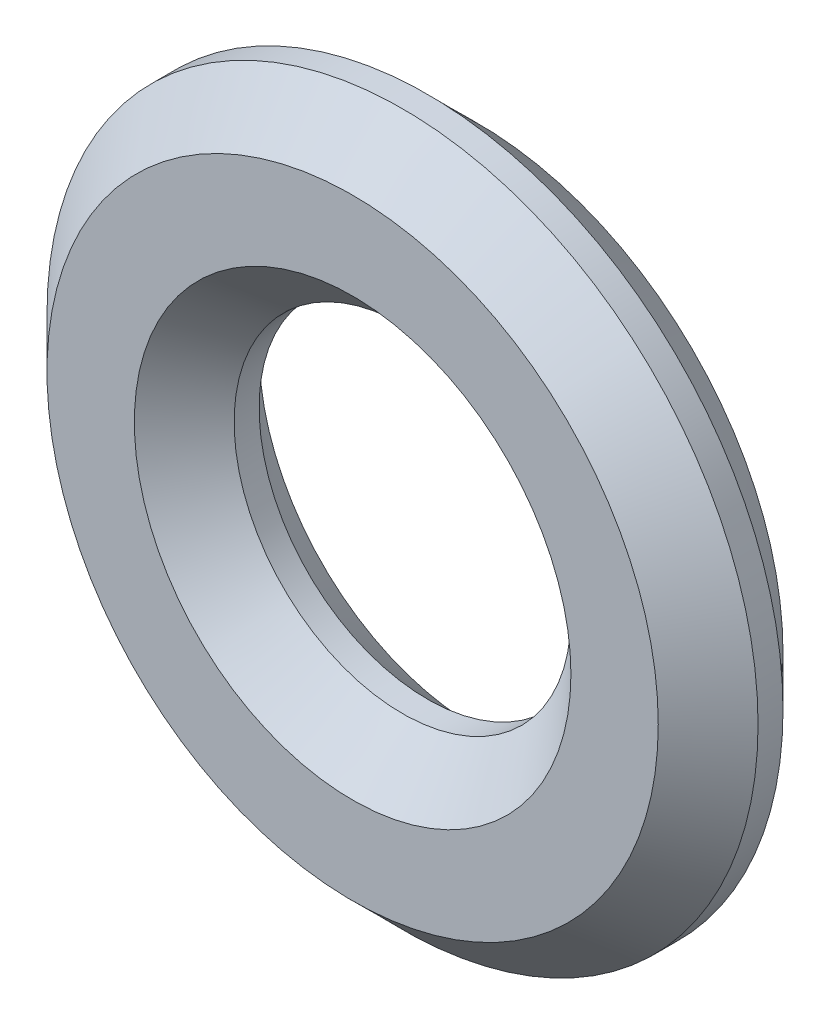
ISO-10303-21;
HEADER;
FILE_DESCRIPTION(('STEP AP214'),'2;1');
FILE_NAME('part.step','',(''),(''),'','','');
FILE_SCHEMA(('AUTOMOTIVE_DESIGN { 1 0 10303 214 1 1 1 1 }'));
ENDSEC;
DATA;
#1=APPLICATION_CONTEXT('core data for automotive mechanical design processes');
#2=APPLICATION_PROTOCOL_DEFINITION('international standard','automotive_design',2000,#1);
#3=PRODUCT_CONTEXT('',#1,'mechanical');
#4=PRODUCT('Part','Part','',(#3));
#5=PRODUCT_RELATED_PRODUCT_CATEGORY('part','',(#4));
#6=PRODUCT_DEFINITION_FORMATION('','',#4);
#7=PRODUCT_DEFINITION_CONTEXT('part definition',#1,'design');
#8=PRODUCT_DEFINITION('design','',#6,#7);
#9=PRODUCT_DEFINITION_SHAPE('','',#8);
#10=(LENGTH_UNIT() NAMED_UNIT(*) SI_UNIT(.MILLI.,.METRE.));
#11=(NAMED_UNIT(*) PLANE_ANGLE_UNIT() SI_UNIT($,.RADIAN.));
#12=(NAMED_UNIT(*) SI_UNIT($,.STERADIAN.) SOLID_ANGLE_UNIT());
#13=UNCERTAINTY_MEASURE_WITH_UNIT(LENGTH_MEASURE(1.E-05),#10,'distance_accuracy_value','');
#14=(GEOMETRIC_REPRESENTATION_CONTEXT(3) GLOBAL_UNCERTAINTY_ASSIGNED_CONTEXT((#13)) GLOBAL_UNIT_ASSIGNED_CONTEXT((#10,
#11,#12)) REPRESENTATION_CONTEXT('',''));
#15=CARTESIAN_POINT('',(0.,0.,0.));
#16=DIRECTION('',(0.,0.,1.));
#17=DIRECTION('',(1.,0.,0.));
#18=AXIS2_PLACEMENT_3D('',#15,#16,#17);
#19=CARTESIAN_POINT('',(0.,0.,2.));
#20=DIRECTION('',(0.,0.,1.));
#21=DIRECTION('',(1.,0.,0.));
#22=AXIS2_PLACEMENT_3D('',#19,#20,#21);
#23=PLANE('',#22);
#24=CARTESIAN_POINT('',(0.,0.,2.));
#25=DIRECTION('',(0.,0.,1.));
#26=DIRECTION('',(1.,0.,0.));
#27=AXIS2_PLACEMENT_3D('',#24,#25,#26);
#28=CIRCLE('',#27,3.5);
#29=CARTESIAN_POINT('',(3.5,0.,2.));
#30=VERTEX_POINT('',#29);
#31=EDGE_CURVE('E10',#30,#30,#28,.F.);
#32=ORIENTED_EDGE('',*,*,#31,.T.);
#33=EDGE_LOOP('',(#32));
#34=FACE_BOUND('',#33,.T.);
#35=CARTESIAN_POINT('',(0.,0.,2.));
#36=DIRECTION('',(0.,0.,1.));
#37=DIRECTION('',(1.,0.,0.));
#38=AXIS2_PLACEMENT_3D('',#35,#36,#37);
#39=CIRCLE('',#38,4.9);
#40=CARTESIAN_POINT('',(4.9,0.,2.));
#41=VERTEX_POINT('',#40);
#42=EDGE_CURVE('E40',#41,#41,#39,.T.);
#43=ORIENTED_EDGE('',*,*,#42,.T.);
#44=EDGE_LOOP('',(#43));
#45=FACE_BOUND('',#44,.T.);
#46=ADVANCED_FACE('F33',(#34,#45),#23,.T.);
#47=CARTESIAN_POINT('',(0.,0.,0.));
#48=DIRECTION('',(0.,0.,1.));
#49=DIRECTION('',(1.,0.,0.));
#50=AXIS2_PLACEMENT_3D('',#47,#48,#49);
#51=PLANE('',#50);
#52=CARTESIAN_POINT('',(0.,0.,0.));
#53=DIRECTION('',(0.,0.,1.));
#54=DIRECTION('',(1.,0.,0.));
#55=AXIS2_PLACEMENT_3D('',#52,#53,#54);
#56=CIRCLE('',#55,3.5);
#57=CARTESIAN_POINT('',(3.5,0.,0.));
#58=VERTEX_POINT('',#57);
#59=EDGE_CURVE('E59',#58,#58,#56,.T.);
#60=ORIENTED_EDGE('',*,*,#59,.T.);
#61=EDGE_LOOP('',(#60));
#62=FACE_BOUND('',#61,.T.);
#63=CARTESIAN_POINT('',(0.,0.,0.));
#64=DIRECTION('',(0.,0.,1.));
#65=DIRECTION('',(1.,0.,0.));
#66=AXIS2_PLACEMENT_3D('',#63,#64,#65);
#67=CIRCLE('',#66,4.9);
#68=CARTESIAN_POINT('',(4.9,0.,0.));
#69=VERTEX_POINT('',#68);
#70=EDGE_CURVE('E62',#69,#69,#67,.F.);
#71=ORIENTED_EDGE('',*,*,#70,.T.);
#72=EDGE_LOOP('',(#71));
#73=FACE_BOUND('',#72,.T.);
#74=ADVANCED_FACE('F66',(#62,#73),#51,.F.);
#75=CARTESIAN_POINT('',(0.,0.,2.));
#76=DIRECTION('',(0.,0.,-1.));
#77=DIRECTION('',(-1.,0.,0.));
#78=AXIS2_PLACEMENT_3D('',#75,#76,#77);
#79=CYLINDRICAL_SURFACE('',#78,5.7);
#80=CARTESIAN_POINT('',(0.,0.,0.799999999999999));
#81=DIRECTION('',(0.,0.,1.));
#82=DIRECTION('',(1.,0.,0.));
#83=AXIS2_PLACEMENT_3D('',#80,#81,#82);
#84=CIRCLE('',#83,5.7);
#85=CARTESIAN_POINT('',(5.7,0.,0.799999999999999));
#86=VERTEX_POINT('',#85);
#87=EDGE_CURVE('E44',#86,#86,#84,.T.);
#88=ORIENTED_EDGE('',*,*,#87,.T.);
#89=EDGE_LOOP('',(#88));
#90=FACE_BOUND('',#89,.T.);
#91=CARTESIAN_POINT('',(0.,0.,1.2));
#92=DIRECTION('',(0.,0.,1.));
#93=DIRECTION('',(1.,0.,0.));
#94=AXIS2_PLACEMENT_3D('',#91,#92,#93);
#95=CIRCLE('',#94,5.7);
#96=CARTESIAN_POINT('',(5.7,0.,1.2));
#97=VERTEX_POINT('',#96);
#98=EDGE_CURVE('E48',#97,#97,#95,.F.);
#99=ORIENTED_EDGE('',*,*,#98,.T.);
#100=EDGE_LOOP('',(#99));
#101=FACE_BOUND('',#100,.T.);
#102=ADVANCED_FACE('F76',(#90,#101),#79,.T.);
#103=CARTESIAN_POINT('',(0.,0.,2.));
#104=DIRECTION('',(0.,0.,-1.));
#105=DIRECTION('',(-1.,0.,0.));
#106=AXIS2_PLACEMENT_3D('',#103,#104,#105);
#107=CYLINDRICAL_SURFACE('',#106,2.7);
#108=CARTESIAN_POINT('',(0.,0.,0.800000000000003));
#109=DIRECTION('',(0.,0.,1.));
#110=DIRECTION('',(1.,0.,0.));
#111=AXIS2_PLACEMENT_3D('',#108,#109,#110);
#112=CIRCLE('',#111,2.7);
#113=CARTESIAN_POINT('',(2.7,0.,0.800000000000003));
#114=VERTEX_POINT('',#113);
#115=EDGE_CURVE('E53',#114,#114,#112,.F.);
#116=ORIENTED_EDGE('',*,*,#115,.T.);
#117=EDGE_LOOP('',(#116));
#118=FACE_BOUND('',#117,.T.);
#119=CARTESIAN_POINT('',(0.,0.,1.2));
#120=DIRECTION('',(0.,0.,1.));
#121=DIRECTION('',(1.,0.,0.));
#122=AXIS2_PLACEMENT_3D('',#119,#120,#121);
#123=CIRCLE('',#122,2.7);
#124=CARTESIAN_POINT('',(2.7,0.,1.2));
#125=VERTEX_POINT('',#124);
#126=EDGE_CURVE('E56',#125,#125,#123,.T.);
#127=ORIENTED_EDGE('',*,*,#126,.T.);
#128=EDGE_LOOP('',(#127));
#129=FACE_BOUND('',#128,.T.);
#130=ADVANCED_FACE('F79',(#118,#129),#107,.F.);
#131=CARTESIAN_POINT('',(0.,0.,0.));
#132=DIRECTION('',(0.,0.,-1.));
#133=DIRECTION('',(-1.,0.,0.));
#134=AXIS2_PLACEMENT_3D('',#131,#132,#133);
#135=CONICAL_SURFACE('',#134,3.5,0.785398163397446);
#136=ORIENTED_EDGE('',*,*,#115,.F.);
#137=EDGE_LOOP('',(#136));
#138=FACE_BOUND('',#137,.T.);
#139=ORIENTED_EDGE('',*,*,#59,.F.);
#140=EDGE_LOOP('',(#139));
#141=FACE_BOUND('',#140,.T.);
#142=ADVANCED_FACE('F72',(#138,#141),#135,.F.);
#143=CARTESIAN_POINT('',(0.,0.,0.799999999999999));
#144=DIRECTION('',(0.,0.,1.));
#145=DIRECTION('',(1.,0.,0.));
#146=AXIS2_PLACEMENT_3D('',#143,#144,#145);
#147=CONICAL_SURFACE('',#146,5.7,0.78539816339745);
#148=CARTESIAN_POINT('',(4.9,0.,0.));
#149=CARTESIAN_POINT('',(4.90833333333333,0.,0.0083333333333334));
#150=CARTESIAN_POINT('',(4.91666666666666,0.,0.0166666666666667));
#151=CARTESIAN_POINT('',(4.93333333333333,0.,0.0333333333333332));
#152=CARTESIAN_POINT('',(4.94166666666666,0.,0.0416666666666665));
#153=CARTESIAN_POINT('',(4.95833333333333,0.,0.0583333333333332));
#154=CARTESIAN_POINT('',(4.96666666666666,0.,0.0666666666666665));
#155=CARTESIAN_POINT('',(4.98333333333333,0.,0.0833333333333332));
#156=CARTESIAN_POINT('',(4.99166666666666,0.,0.0916666666666665));
#157=CARTESIAN_POINT('',(5.00833333333333,0.,0.108333333333333));
#158=CARTESIAN_POINT('',(5.01666666666666,0.,0.116666666666667));
#159=CARTESIAN_POINT('',(5.03333333333333,0.,0.133333333333333));
#160=CARTESIAN_POINT('',(5.04166666666667,0.,0.141666666666666));
#161=CARTESIAN_POINT('',(5.05833333333333,0.,0.158333333333333));
#162=CARTESIAN_POINT('',(5.06666666666666,0.,0.166666666666666));
#163=CARTESIAN_POINT('',(5.08333333333333,0.,0.183333333333333));
#164=CARTESIAN_POINT('',(5.09166666666666,0.,0.191666666666666));
#165=CARTESIAN_POINT('',(5.10833333333333,0.,0.208333333333333));
#166=CARTESIAN_POINT('',(5.11666666666666,0.,0.216666666666667));
#167=CARTESIAN_POINT('',(5.13333333333333,0.,0.233333333333333));
#168=CARTESIAN_POINT('',(5.14166666666666,0.,0.241666666666666));
#169=CARTESIAN_POINT('',(5.15833333333333,0.,0.258333333333333));
#170=CARTESIAN_POINT('',(5.16666666666667,0.,0.266666666666666));
#171=CARTESIAN_POINT('',(5.18333333333333,0.,0.283333333333333));
#172=CARTESIAN_POINT('',(5.19166666666666,0.,0.291666666666667));
#173=CARTESIAN_POINT('',(5.20833333333333,0.,0.308333333333333));
#174=CARTESIAN_POINT('',(5.21666666666667,0.,0.316666666666666));
#175=CARTESIAN_POINT('',(5.23333333333333,0.,0.333333333333333));
#176=CARTESIAN_POINT('',(5.24166666666667,0.,0.341666666666666));
#177=CARTESIAN_POINT('',(5.25833333333333,0.,0.358333333333333));
#178=CARTESIAN_POINT('',(5.26666666666666,0.,0.366666666666666));
#179=CARTESIAN_POINT('',(5.28333333333333,0.,0.383333333333333));
#180=CARTESIAN_POINT('',(5.29166666666667,0.,0.391666666666666));
#181=CARTESIAN_POINT('',(5.30833333333333,0.,0.408333333333333));
#182=CARTESIAN_POINT('',(5.31666666666667,0.,0.416666666666666));
#183=CARTESIAN_POINT('',(5.33333333333333,0.,0.433333333333333));
#184=CARTESIAN_POINT('',(5.34166666666667,0.,0.441666666666666));
#185=CARTESIAN_POINT('',(5.35833333333333,0.,0.458333333333333));
#186=CARTESIAN_POINT('',(5.36666666666667,0.,0.466666666666666));
#187=CARTESIAN_POINT('',(5.38333333333333,0.,0.483333333333333));
#188=CARTESIAN_POINT('',(5.39166666666667,0.,0.491666666666666));
#189=CARTESIAN_POINT('',(5.40833333333333,0.,0.508333333333333));
#190=CARTESIAN_POINT('',(5.41666666666667,0.,0.516666666666666));
#191=CARTESIAN_POINT('',(5.43333333333333,0.,0.533333333333333));
#192=CARTESIAN_POINT('',(5.44166666666667,0.,0.541666666666666));
#193=CARTESIAN_POINT('',(5.45833333333333,0.,0.558333333333333));
#194=CARTESIAN_POINT('',(5.46666666666667,0.,0.566666666666666));
#195=CARTESIAN_POINT('',(5.48333333333333,0.,0.583333333333333));
#196=CARTESIAN_POINT('',(5.49166666666667,0.,0.591666666666666));
#197=CARTESIAN_POINT('',(5.50833333333333,0.,0.608333333333333));
#198=CARTESIAN_POINT('',(5.51666666666667,0.,0.616666666666666));
#199=CARTESIAN_POINT('',(5.53333333333333,0.,0.633333333333333));
#200=CARTESIAN_POINT('',(5.54166666666667,0.,0.641666666666666));
#201=CARTESIAN_POINT('',(5.55833333333333,0.,0.658333333333333));
#202=CARTESIAN_POINT('',(5.56666666666667,0.,0.666666666666666));
#203=CARTESIAN_POINT('',(5.58333333333333,0.,0.683333333333333));
#204=CARTESIAN_POINT('',(5.59166666666667,0.,0.691666666666666));
#205=CARTESIAN_POINT('',(5.60833333333333,0.,0.708333333333333));
#206=CARTESIAN_POINT('',(5.61666666666667,0.,0.716666666666666));
#207=CARTESIAN_POINT('',(5.63333333333333,0.,0.733333333333333));
#208=CARTESIAN_POINT('',(5.64166666666667,0.,0.741666666666666));
#209=CARTESIAN_POINT('',(5.65833333333333,0.,0.758333333333333));
#210=CARTESIAN_POINT('',(5.66666666666667,0.,0.766666666666666));
#211=CARTESIAN_POINT('',(5.68333333333333,0.,0.783333333333333));
#212=CARTESIAN_POINT('',(5.69166666666667,0.,0.791666666666666));
#213=CARTESIAN_POINT('',(5.7,0.,0.799999999999999));
#214=B_SPLINE_CURVE_WITH_KNOTS('',3,(#148,#149,#150,#151,#152,#153,#154,#155,#156,#157,#158,
#159,#160,#161,#162,#163,#164,#165,#166,#167,#168,#169,#170,#171,#172,#173,#174,#175,#176,#177,
#178,#179,#180,#181,#182,#183,#184,#185,#186,#187,#188,#189,#190,#191,#192,#193,#194,#195,#196,
#197,#198,#199,#200,#201,#202,#203,#204,#205,#206,#207,#208,#209,#210,#211,#212,#213),
.UNSPECIFIED.,.F.,.F.,(4,2,2,2,2,2,2,2,2,2,2,2,2,2,2,2,2,2,2,2,2,2,2,2,2,2,2,2,2,2,2,2,4),(0.,
0.0353553390593272,0.0707106781186552,0.106066017177982,0.14142135623731,0.176776695296637,
0.212132034355965,0.247487373415292,0.282842712474619,0.318198051533947,0.353553390593275,
0.388908729652602,0.424264068711929,0.459619407771257,0.494974746830584,0.530330085889911,
0.565685424949239,0.601040764008567,0.636396103067894,0.671751442127221,0.707106781186549,
0.742462120245876,0.777817459305204,0.813172798364531,0.848528137423859,0.883883476483186,
0.919238815542513,0.954594154601841,0.989949493661168,1.0253048327205,1.06066017177982,
1.09601551083915,1.13137084989848),.UNSPECIFIED.);
#215=EDGE_CURVE('BSEAM68',#69,#86,#214,.T.);
#216=ORIENTED_EDGE('',*,*,#70,.F.);
#217=ORIENTED_EDGE('',*,*,#87,.F.);
#218=ORIENTED_EDGE('',*,*,#215,.T.);
#219=ORIENTED_EDGE('',*,*,#215,.F.);
#220=EDGE_LOOP('',(#216,#218,#217,#219));
#221=FACE_BOUND('',#220,.T.);
#222=ADVANCED_FACE('F68',(#221),#147,.T.);
#223=CARTESIAN_POINT('',(0.,0.,1.2));
#224=DIRECTION('',(0.,0.,1.));
#225=DIRECTION('',(1.,0.,0.));
#226=AXIS2_PLACEMENT_3D('',#223,#224,#225);
#227=CONICAL_SURFACE('',#226,2.7,0.78539816339745);
#228=CARTESIAN_POINT('',(3.5,0.,2.));
#229=CARTESIAN_POINT('',(3.49166666666667,0.,1.99166666666667));
#230=CARTESIAN_POINT('',(3.48333333333333,0.,1.98333333333333));
#231=CARTESIAN_POINT('',(3.46666666666667,0.,1.96666666666667));
#232=CARTESIAN_POINT('',(3.45833333333333,0.,1.95833333333333));
#233=CARTESIAN_POINT('',(3.44166666666667,0.,1.94166666666667));
#234=CARTESIAN_POINT('',(3.43333333333333,0.,1.93333333333333));
#235=CARTESIAN_POINT('',(3.41666666666667,0.,1.91666666666667));
#236=CARTESIAN_POINT('',(3.40833333333333,0.,1.90833333333333));
#237=CARTESIAN_POINT('',(3.39166666666667,0.,1.89166666666667));
#238=CARTESIAN_POINT('',(3.38333333333333,0.,1.88333333333333));
#239=CARTESIAN_POINT('',(3.36666666666667,0.,1.86666666666667));
#240=CARTESIAN_POINT('',(3.35833333333333,0.,1.85833333333333));
#241=CARTESIAN_POINT('',(3.34166666666667,0.,1.84166666666667));
#242=CARTESIAN_POINT('',(3.33333333333333,0.,1.83333333333333));
#243=CARTESIAN_POINT('',(3.31666666666667,0.,1.81666666666667));
#244=CARTESIAN_POINT('',(3.30833333333333,0.,1.80833333333333));
#245=CARTESIAN_POINT('',(3.29166666666667,0.,1.79166666666667));
#246=CARTESIAN_POINT('',(3.28333333333333,0.,1.78333333333333));
#247=CARTESIAN_POINT('',(3.26666666666667,0.,1.76666666666667));
#248=CARTESIAN_POINT('',(3.25833333333333,0.,1.75833333333333));
#249=CARTESIAN_POINT('',(3.24166666666667,0.,1.74166666666667));
#250=CARTESIAN_POINT('',(3.23333333333333,0.,1.73333333333333));
#251=CARTESIAN_POINT('',(3.21666666666667,0.,1.71666666666667));
#252=CARTESIAN_POINT('',(3.20833333333333,0.,1.70833333333333));
#253=CARTESIAN_POINT('',(3.19166666666667,0.,1.69166666666667));
#254=CARTESIAN_POINT('',(3.18333333333333,0.,1.68333333333333));
#255=CARTESIAN_POINT('',(3.16666666666667,0.,1.66666666666667));
#256=CARTESIAN_POINT('',(3.15833333333333,0.,1.65833333333333));
#257=CARTESIAN_POINT('',(3.14166666666667,0.,1.64166666666667));
#258=CARTESIAN_POINT('',(3.13333333333333,0.,1.63333333333333));
#259=CARTESIAN_POINT('',(3.11666666666667,0.,1.61666666666667));
#260=CARTESIAN_POINT('',(3.10833333333333,0.,1.60833333333333));
#261=CARTESIAN_POINT('',(3.09166666666667,0.,1.59166666666667));
#262=CARTESIAN_POINT('',(3.08333333333333,0.,1.58333333333333));
#263=CARTESIAN_POINT('',(3.06666666666667,0.,1.56666666666667));
#264=CARTESIAN_POINT('',(3.05833333333333,0.,1.55833333333333));
#265=CARTESIAN_POINT('',(3.04166666666667,0.,1.54166666666667));
#266=CARTESIAN_POINT('',(3.03333333333333,0.,1.53333333333333));
#267=CARTESIAN_POINT('',(3.01666666666667,0.,1.51666666666667));
#268=CARTESIAN_POINT('',(3.00833333333333,0.,1.50833333333333));
#269=CARTESIAN_POINT('',(2.99166666666667,0.,1.49166666666667));
#270=CARTESIAN_POINT('',(2.98333333333333,0.,1.48333333333333));
#271=CARTESIAN_POINT('',(2.96666666666667,0.,1.46666666666667));
#272=CARTESIAN_POINT('',(2.95833333333333,0.,1.45833333333333));
#273=CARTESIAN_POINT('',(2.94166666666667,0.,1.44166666666667));
#274=CARTESIAN_POINT('',(2.93333333333333,0.,1.43333333333333));
#275=CARTESIAN_POINT('',(2.91666666666667,0.,1.41666666666667));
#276=CARTESIAN_POINT('',(2.90833333333333,0.,1.40833333333333));
#277=CARTESIAN_POINT('',(2.89166666666667,0.,1.39166666666667));
#278=CARTESIAN_POINT('',(2.88333333333333,0.,1.38333333333333));
#279=CARTESIAN_POINT('',(2.86666666666667,0.,1.36666666666667));
#280=CARTESIAN_POINT('',(2.85833333333333,0.,1.35833333333333));
#281=CARTESIAN_POINT('',(2.84166666666667,0.,1.34166666666667));
#282=CARTESIAN_POINT('',(2.83333333333333,0.,1.33333333333333));
#283=CARTESIAN_POINT('',(2.81666666666667,0.,1.31666666666667));
#284=CARTESIAN_POINT('',(2.80833333333333,0.,1.30833333333333));
#285=CARTESIAN_POINT('',(2.79166666666667,0.,1.29166666666667));
#286=CARTESIAN_POINT('',(2.78333333333333,0.,1.28333333333333));
#287=CARTESIAN_POINT('',(2.76666666666667,0.,1.26666666666667));
#288=CARTESIAN_POINT('',(2.75833333333333,0.,1.25833333333333));
#289=CARTESIAN_POINT('',(2.74166666666667,0.,1.24166666666667));
#290=CARTESIAN_POINT('',(2.73333333333333,0.,1.23333333333333));
#291=CARTESIAN_POINT('',(2.71666666666667,0.,1.21666666666667));
#292=CARTESIAN_POINT('',(2.70833333333333,0.,1.20833333333334));
#293=CARTESIAN_POINT('',(2.7,0.,1.2));
#294=B_SPLINE_CURVE_WITH_KNOTS('',3,(#228,#229,#230,#231,#232,#233,#234,#235,#236,#237,#238,
#239,#240,#241,#242,#243,#244,#245,#246,#247,#248,#249,#250,#251,#252,#253,#254,#255,#256,#257,
#258,#259,#260,#261,#262,#263,#264,#265,#266,#267,#268,#269,#270,#271,#272,#273,#274,#275,#276,
#277,#278,#279,#280,#281,#282,#283,#284,#285,#286,#287,#288,#289,#290,#291,#292,#293),
.UNSPECIFIED.,.F.,.F.,(4,2,2,2,2,2,2,2,2,2,2,2,2,2,2,2,2,2,2,2,2,2,2,2,2,2,2,2,2,2,2,2,4),(0.,
0.0353553390593272,0.0707106781186546,0.106066017177982,0.141421356237309,0.176776695296637,
0.212132034355964,0.247487373415291,0.282842712474619,0.318198051533946,0.353553390593274,
0.388908729652601,0.424264068711928,0.459619407771256,0.494974746830583,0.530330085889911,
0.565685424949238,0.601040764008565,0.636396103067893,0.67175144212722,0.707106781186547,
0.742462120245875,0.777817459305202,0.813172798364529,0.848528137423857,0.883883476483184,
0.919238815542512,0.954594154601839,0.989949493661166,1.02530483272049,1.06066017177982,
1.09601551083915,1.13137084989848),.UNSPECIFIED.);
#295=EDGE_CURVE('BSEAM71',#30,#125,#294,.T.);
#296=ORIENTED_EDGE('',*,*,#31,.F.);
#297=ORIENTED_EDGE('',*,*,#126,.F.);
#298=ORIENTED_EDGE('',*,*,#295,.T.);
#299=ORIENTED_EDGE('',*,*,#295,.F.);
#300=EDGE_LOOP('',(#296,#298,#297,#299));
#301=FACE_BOUND('',#300,.T.);
#302=ADVANCED_FACE('F71',(#301),#227,.F.);
#303=CARTESIAN_POINT('',(0.,0.,2.));
#304=DIRECTION('',(0.,0.,-1.));
#305=DIRECTION('',(-1.,0.,0.));
#306=AXIS2_PLACEMENT_3D('',#303,#304,#305);
#307=CONICAL_SURFACE('',#306,4.9,0.785398163397447);
#308=ORIENTED_EDGE('',*,*,#98,.F.);
#309=EDGE_LOOP('',(#308));
#310=FACE_BOUND('',#309,.T.);
#311=ORIENTED_EDGE('',*,*,#42,.F.);
#312=EDGE_LOOP('',(#311));
#313=FACE_BOUND('',#312,.T.);
#314=ADVANCED_FACE('F35',(#310,#313),#307,.T.);
#315=CLOSED_SHELL('',(#46,#74,#102,#130,#142,#222,#302,#314));
#316=MANIFOLD_SOLID_BREP('B2',#315);
#317=ADVANCED_BREP_SHAPE_REPRESENTATION('',(#18,#316),#14);
#318=SHAPE_DEFINITION_REPRESENTATION(#9,#317);
ENDSEC;
END-ISO-10303-21;
